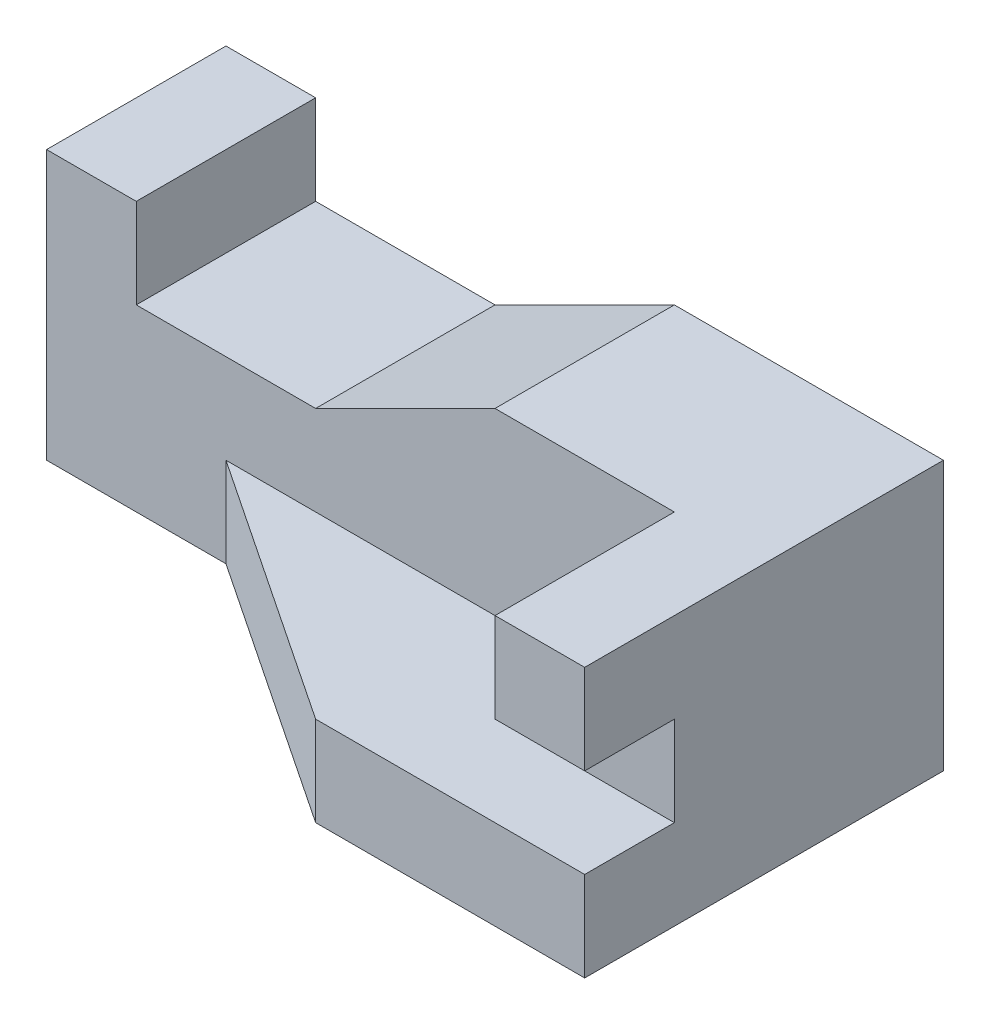
ISO-10303-21;
HEADER;
FILE_DESCRIPTION(('STEP AP214'),'2;1');
FILE_NAME('part.step','',(''),(''),'','','');
FILE_SCHEMA(('AUTOMOTIVE_DESIGN { 1 0 10303 214 1 1 1 1 }'));
ENDSEC;
DATA;
#1=APPLICATION_CONTEXT('core data for automotive mechanical design processes');
#2=APPLICATION_PROTOCOL_DEFINITION('international standard','automotive_design',2000,#1);
#3=PRODUCT_CONTEXT('',#1,'mechanical');
#4=PRODUCT('Part','Part','',(#3));
#5=PRODUCT_RELATED_PRODUCT_CATEGORY('part','',(#4));
#6=PRODUCT_DEFINITION_FORMATION('','',#4);
#7=PRODUCT_DEFINITION_CONTEXT('part definition',#1,'design');
#8=PRODUCT_DEFINITION('design','',#6,#7);
#9=PRODUCT_DEFINITION_SHAPE('','',#8);
#10=(LENGTH_UNIT() NAMED_UNIT(*) SI_UNIT(.MILLI.,.METRE.));
#11=(NAMED_UNIT(*) PLANE_ANGLE_UNIT() SI_UNIT($,.RADIAN.));
#12=(NAMED_UNIT(*) SI_UNIT($,.STERADIAN.) SOLID_ANGLE_UNIT());
#13=UNCERTAINTY_MEASURE_WITH_UNIT(LENGTH_MEASURE(1.E-05),#10,'distance_accuracy_value','');
#14=(GEOMETRIC_REPRESENTATION_CONTEXT(3) GLOBAL_UNCERTAINTY_ASSIGNED_CONTEXT((#13)) GLOBAL_UNIT_ASSIGNED_CONTEXT((#10,
#11,#12)) REPRESENTATION_CONTEXT('',''));
#15=CARTESIAN_POINT('',(0.,0.,0.));
#16=DIRECTION('',(0.,0.,1.));
#17=DIRECTION('',(1.,0.,0.));
#18=AXIS2_PLACEMENT_3D('',#15,#16,#17);
#19=CARTESIAN_POINT('',(0.,0.,30.));
#20=DIRECTION('',(0.,0.,-1.));
#21=DIRECTION('',(-1.,0.,0.));
#22=AXIS2_PLACEMENT_3D('',#19,#20,#21);
#23=PLANE('',#22);
#24=DIRECTION('',(1.,0.,0.));
#25=VECTOR('',#24,1.);
#26=CARTESIAN_POINT('',(30.9664043726146,2.70131461150638,30.));
#27=LINE('',#26,#25);
#28=CARTESIAN_POINT('',(30.9664043726146,2.70131461150638,30.));
#29=VERTEX_POINT('',#28);
#30=CARTESIAN_POINT('',(40.9664043726146,2.70131461150638,30.));
#31=VERTEX_POINT('',#30);
#32=EDGE_CURVE('E48',#29,#31,#27,.T.);
#33=ORIENTED_EDGE('',*,*,#32,.F.);
#34=DIRECTION('',(0.,-1.,0.));
#35=VECTOR('',#34,1.);
#36=CARTESIAN_POINT('',(30.9664043726146,12.7013146115064,30.));
#37=LINE('',#36,#35);
#38=CARTESIAN_POINT('',(30.9664043726146,-7.29868538849361,30.));
#39=VERTEX_POINT('',#38);
#40=EDGE_CURVE('E163',#29,#39,#37,.T.);
#41=ORIENTED_EDGE('',*,*,#40,.T.);
#42=DIRECTION('',(1.,0.,0.));
#43=VECTOR('',#42,1.);
#44=CARTESIAN_POINT('',(40.9664043726146,-7.29868538849361,30.));
#45=LINE('',#44,#43);
#46=CARTESIAN_POINT('',(40.9664043726146,-7.29868538849361,30.));
#47=VERTEX_POINT('',#46);
#48=EDGE_CURVE('E172',#39,#47,#45,.T.);
#49=ORIENTED_EDGE('',*,*,#48,.T.);
#50=DIRECTION('',(0.,1.,0.));
#51=VECTOR('',#50,1.);
#52=CARTESIAN_POINT('',(40.9664043726146,12.7013146115064,30.));
#53=LINE('',#52,#51);
#54=EDGE_CURVE('E53',#47,#31,#53,.T.);
#55=ORIENTED_EDGE('',*,*,#54,.T.);
#56=EDGE_LOOP('',(#33,#41,#49,#55));
#57=FACE_BOUND('',#56,.T.);
#58=ADVANCED_FACE('F33',(#57),#23,.F.);
#59=CARTESIAN_POINT('',(0.,0.,20.));
#60=DIRECTION('',(0.,0.,1.));
#61=DIRECTION('',(1.,0.,0.));
#62=AXIS2_PLACEMENT_3D('',#59,#60,#61);
#63=PLANE('',#62);
#64=DIRECTION('',(-1.,0.,0.));
#65=VECTOR('',#64,1.);
#66=CARTESIAN_POINT('',(40.9664043726146,-7.29868538849361,20.));
#67=LINE('',#66,#65);
#68=CARTESIAN_POINT('',(30.9664043726146,-7.29868538849361,20.));
#69=VERTEX_POINT('',#68);
#70=CARTESIAN_POINT('',(-19.0335956273854,-7.29868538849361,20.));
#71=VERTEX_POINT('',#70);
#72=EDGE_CURVE('E186',#69,#71,#67,.T.);
#73=ORIENTED_EDGE('',*,*,#72,.F.);
#74=DIRECTION('',(0.,-1.,0.));
#75=VECTOR('',#74,1.);
#76=CARTESIAN_POINT('',(30.9664043726146,12.7013146115064,20.));
#77=LINE('',#76,#75);
#78=CARTESIAN_POINT('',(30.9664043726146,12.7013146115064,20.));
#79=VERTEX_POINT('',#78);
#80=EDGE_CURVE('E164',#79,#69,#77,.T.);
#81=ORIENTED_EDGE('',*,*,#80,.F.);
#82=DIRECTION('',(-1.,0.,0.));
#83=VECTOR('',#82,1.);
#84=CARTESIAN_POINT('',(10.9664043726146,12.7013146115064,20.));
#85=LINE('',#84,#83);
#86=CARTESIAN_POINT('',(10.9664043726146,12.7013146115064,20.));
#87=VERTEX_POINT('',#86);
#88=EDGE_CURVE('E203',#79,#87,#85,.T.);
#89=ORIENTED_EDGE('',*,*,#88,.T.);
#90=DIRECTION('',(-0.894427190999916,-0.447213595499958,0.));
#91=VECTOR('',#90,1.);
#92=CARTESIAN_POINT('',(-9.03359562738539,2.70131461150638,20.));
#93=LINE('',#92,#91);
#94=CARTESIAN_POINT('',(-9.03359562738539,2.70131461150638,20.));
#95=VERTEX_POINT('',#94);
#96=EDGE_CURVE('E205',#87,#95,#93,.T.);
#97=ORIENTED_EDGE('',*,*,#96,.T.);
#98=DIRECTION('',(-1.,0.,0.));
#99=VECTOR('',#98,1.);
#100=CARTESIAN_POINT('',(-29.0335956273854,2.70131461150638,20.));
#101=LINE('',#100,#99);
#102=CARTESIAN_POINT('',(-29.0335956273854,2.70131461150638,20.));
#103=VERTEX_POINT('',#102);
#104=EDGE_CURVE('E208',#95,#103,#101,.T.);
#105=ORIENTED_EDGE('',*,*,#104,.T.);
#106=DIRECTION('',(0.,1.,0.));
#107=VECTOR('',#106,1.);
#108=CARTESIAN_POINT('',(-29.0335956273854,12.7013146115064,20.));
#109=LINE('',#108,#107);
#110=CARTESIAN_POINT('',(-29.0335956273854,12.7013146115064,20.));
#111=VERTEX_POINT('',#110);
#112=EDGE_CURVE('E210',#103,#111,#109,.T.);
#113=ORIENTED_EDGE('',*,*,#112,.T.);
#114=DIRECTION('',(-1.,0.,0.));
#115=VECTOR('',#114,1.);
#116=CARTESIAN_POINT('',(-39.0335956273854,12.7013146115064,20.));
#117=LINE('',#116,#115);
#118=CARTESIAN_POINT('',(-39.0335956273854,12.7013146115064,20.));
#119=VERTEX_POINT('',#118);
#120=EDGE_CURVE('E212',#111,#119,#117,.T.);
#121=ORIENTED_EDGE('',*,*,#120,.T.);
#122=DIRECTION('',(0.,-1.,0.));
#123=VECTOR('',#122,1.);
#124=CARTESIAN_POINT('',(-39.0335956273854,-17.2986853884936,20.));
#125=LINE('',#124,#123);
#126=CARTESIAN_POINT('',(-39.0335956273854,-17.2986853884936,20.));
#127=VERTEX_POINT('',#126);
#128=EDGE_CURVE('E214',#119,#127,#125,.T.);
#129=ORIENTED_EDGE('',*,*,#128,.T.);
#130=DIRECTION('',(1.,0.,0.));
#131=VECTOR('',#130,1.);
#132=CARTESIAN_POINT('',(-39.0335956273854,-17.2986853884936,20.));
#133=LINE('',#132,#131);
#134=CARTESIAN_POINT('',(-19.0335956273854,-17.2986853884936,20.));
#135=VERTEX_POINT('',#134);
#136=EDGE_CURVE('E216',#127,#135,#133,.T.);
#137=ORIENTED_EDGE('',*,*,#136,.T.);
#138=DIRECTION('',(0.,-1.,0.));
#139=VECTOR('',#138,1.);
#140=CARTESIAN_POINT('',(-19.0335956273854,-7.29868538849361,20.));
#141=LINE('',#140,#139);
#142=EDGE_CURVE('E182',#71,#135,#141,.T.);
#143=ORIENTED_EDGE('',*,*,#142,.F.);
#144=EDGE_LOOP('',(#73,#81,#89,#97,#105,#113,#121,#129,#137,#143));
#145=FACE_BOUND('',#144,.T.);
#146=ADVANCED_FACE('F277',(#145),#63,.T.);
#147=CARTESIAN_POINT('',(40.9664043726146,-7.29868538849361,40.));
#148=DIRECTION('',(0.,-1.,0.));
#149=DIRECTION('',(1.,0.,0.));
#150=AXIS2_PLACEMENT_3D('',#147,#148,#149);
#151=PLANE('',#150);
#152=DIRECTION('',(0.,0.,-1.));
#153=VECTOR('',#152,1.);
#154=CARTESIAN_POINT('',(30.9664043726146,-7.29868538849361,30.));
#155=LINE('',#154,#153);
#156=EDGE_CURVE('E173',#39,#69,#155,.T.);
#157=ORIENTED_EDGE('',*,*,#156,.T.);
#158=ORIENTED_EDGE('',*,*,#72,.T.);
#159=DIRECTION('',(-0.832050294337844,0.,-0.554700196225229));
#160=VECTOR('',#159,1.);
#161=CARTESIAN_POINT('',(10.9664043726146,-7.29868538849361,40.));
#162=LINE('',#161,#160);
#163=CARTESIAN_POINT('',(10.9664043726146,-7.29868538849361,40.));
#164=VERTEX_POINT('',#163);
#165=EDGE_CURVE('E179',#164,#71,#162,.T.);
#166=ORIENTED_EDGE('',*,*,#165,.F.);
#167=DIRECTION('',(-1.,0.,0.));
#168=VECTOR('',#167,1.);
#169=CARTESIAN_POINT('',(40.9664043726146,-7.29868538849361,40.));
#170=LINE('',#169,#168);
#171=CARTESIAN_POINT('',(40.9664043726146,-7.29868538849361,40.));
#172=VERTEX_POINT('',#171);
#173=EDGE_CURVE('E190',#172,#164,#170,.T.);
#174=ORIENTED_EDGE('',*,*,#173,.F.);
#175=DIRECTION('',(0.,0.,-1.));
#176=VECTOR('',#175,1.);
#177=CARTESIAN_POINT('',(40.9664043726146,-7.29868538849361,40.));
#178=LINE('',#177,#176);
#179=EDGE_CURVE('E199',#172,#47,#178,.T.);
#180=ORIENTED_EDGE('',*,*,#179,.T.);
#181=ORIENTED_EDGE('',*,*,#48,.F.);
#182=EDGE_LOOP('',(#157,#158,#166,#174,#180,#181));
#183=FACE_BOUND('',#182,.T.);
#184=ADVANCED_FACE('F299',(#183),#151,.F.);
#185=CARTESIAN_POINT('',(10.9664043726146,12.7013146115064,20.));
#186=DIRECTION('',(0.,-1.,0.));
#187=DIRECTION('',(0.,0.,-1.));
#188=AXIS2_PLACEMENT_3D('',#185,#186,#187);
#189=PLANE('',#188);
#190=DIRECTION('',(-1.,0.,0.));
#191=VECTOR('',#190,1.);
#192=CARTESIAN_POINT('',(10.9664043726146,12.7013146115064,0.));
#193=LINE('',#192,#191);
#194=CARTESIAN_POINT('',(40.9664043726146,12.7013146115064,0.));
#195=VERTEX_POINT('',#194);
#196=CARTESIAN_POINT('',(10.9664043726146,12.7013146115064,0.));
#197=VERTEX_POINT('',#196);
#198=EDGE_CURVE('E202',#195,#197,#193,.T.);
#199=ORIENTED_EDGE('',*,*,#198,.T.);
#200=DIRECTION('',(0.,0.,-1.));
#201=VECTOR('',#200,1.);
#202=CARTESIAN_POINT('',(10.9664043726146,12.7013146115064,20.));
#203=LINE('',#202,#201);
#204=EDGE_CURVE('E11',#87,#197,#203,.T.);
#205=ORIENTED_EDGE('',*,*,#204,.F.);
#206=ORIENTED_EDGE('',*,*,#88,.F.);
#207=DIRECTION('',(0.,0.,-1.));
#208=VECTOR('',#207,1.);
#209=CARTESIAN_POINT('',(30.9664043726146,12.7013146115064,30.));
#210=LINE('',#209,#208);
#211=CARTESIAN_POINT('',(30.9664043726146,12.7013146115064,40.));
#212=VERTEX_POINT('',#211);
#213=EDGE_CURVE('E176',#212,#79,#210,.T.);
#214=ORIENTED_EDGE('',*,*,#213,.F.);
#215=DIRECTION('',(-1.,0.,0.));
#216=VECTOR('',#215,1.);
#217=CARTESIAN_POINT('',(30.9664043726146,12.7013146115064,40.));
#218=LINE('',#217,#216);
#219=CARTESIAN_POINT('',(40.9664043726146,12.7013146115064,40.));
#220=VERTEX_POINT('',#219);
#221=EDGE_CURVE('E156',#220,#212,#218,.T.);
#222=ORIENTED_EDGE('',*,*,#221,.F.);
#223=DIRECTION('',(0.,0.,-1.));
#224=VECTOR('',#223,1.);
#225=CARTESIAN_POINT('',(40.9664043726146,12.7013146115064,20.));
#226=LINE('',#225,#224);
#227=EDGE_CURVE('E219',#220,#195,#226,.T.);
#228=ORIENTED_EDGE('',*,*,#227,.T.);
#229=EDGE_LOOP('',(#199,#205,#206,#214,#222,#228));
#230=FACE_BOUND('',#229,.T.);
#231=ADVANCED_FACE('F35',(#230),#189,.F.);
#232=CARTESIAN_POINT('',(-9.03359562738539,2.70131461150638,20.));
#233=DIRECTION('',(0.447213595499958,-0.894427190999916,0.));
#234=DIRECTION('',(0.894427190999916,0.447213595499958,0.));
#235=AXIS2_PLACEMENT_3D('',#232,#233,#234);
#236=PLANE('',#235);
#237=DIRECTION('',(-0.894427190999916,-0.447213595499958,0.));
#238=VECTOR('',#237,1.);
#239=CARTESIAN_POINT('',(-9.03359562738539,2.70131461150638,0.));
#240=LINE('',#239,#238);
#241=CARTESIAN_POINT('',(-9.03359562738539,2.70131461150638,0.));
#242=VERTEX_POINT('',#241);
#243=EDGE_CURVE('E222',#197,#242,#240,.T.);
#244=ORIENTED_EDGE('',*,*,#243,.T.);
#245=DIRECTION('',(0.,0.,-1.));
#246=VECTOR('',#245,1.);
#247=CARTESIAN_POINT('',(-9.03359562738539,2.70131461150638,20.));
#248=LINE('',#247,#246);
#249=EDGE_CURVE('E41',#95,#242,#248,.T.);
#250=ORIENTED_EDGE('',*,*,#249,.F.);
#251=ORIENTED_EDGE('',*,*,#96,.F.);
#252=ORIENTED_EDGE('',*,*,#204,.T.);
#253=EDGE_LOOP('',(#244,#250,#251,#252));
#254=FACE_BOUND('',#253,.T.);
#255=ADVANCED_FACE('F281',(#254),#236,.F.);
#256=CARTESIAN_POINT('',(-29.0335956273854,2.70131461150638,20.));
#257=DIRECTION('',(0.,-1.,0.));
#258=DIRECTION('',(0.,0.,-1.));
#259=AXIS2_PLACEMENT_3D('',#256,#257,#258);
#260=PLANE('',#259);
#261=DIRECTION('',(-1.,0.,0.));
#262=VECTOR('',#261,1.);
#263=CARTESIAN_POINT('',(-29.0335956273854,2.70131461150638,0.));
#264=LINE('',#263,#262);
#265=CARTESIAN_POINT('',(-29.0335956273854,2.70131461150638,0.));
#266=VERTEX_POINT('',#265);
#267=EDGE_CURVE('E224',#242,#266,#264,.T.);
#268=ORIENTED_EDGE('',*,*,#267,.T.);
#269=DIRECTION('',(0.,0.,-1.));
#270=VECTOR('',#269,1.);
#271=CARTESIAN_POINT('',(-29.0335956273854,2.70131461150638,20.));
#272=LINE('',#271,#270);
#273=EDGE_CURVE('E249',#103,#266,#272,.T.);
#274=ORIENTED_EDGE('',*,*,#273,.F.);
#275=ORIENTED_EDGE('',*,*,#104,.F.);
#276=ORIENTED_EDGE('',*,*,#249,.T.);
#277=EDGE_LOOP('',(#268,#274,#275,#276));
#278=FACE_BOUND('',#277,.T.);
#279=ADVANCED_FACE('F256',(#278),#260,.F.);
#280=CARTESIAN_POINT('',(-29.0335956273854,12.7013146115064,20.));
#281=DIRECTION('',(-1.,0.,0.));
#282=DIRECTION('',(0.,0.,1.));
#283=AXIS2_PLACEMENT_3D('',#280,#281,#282);
#284=PLANE('',#283);
#285=DIRECTION('',(0.,1.,0.));
#286=VECTOR('',#285,1.);
#287=CARTESIAN_POINT('',(-29.0335956273854,12.7013146115064,0.));
#288=LINE('',#287,#286);
#289=CARTESIAN_POINT('',(-29.0335956273854,12.7013146115064,0.));
#290=VERTEX_POINT('',#289);
#291=EDGE_CURVE('E226',#266,#290,#288,.T.);
#292=ORIENTED_EDGE('',*,*,#291,.T.);
#293=DIRECTION('',(0.,0.,-1.));
#294=VECTOR('',#293,1.);
#295=CARTESIAN_POINT('',(-29.0335956273854,12.7013146115064,20.));
#296=LINE('',#295,#294);
#297=EDGE_CURVE('E246',#111,#290,#296,.T.);
#298=ORIENTED_EDGE('',*,*,#297,.F.);
#299=ORIENTED_EDGE('',*,*,#112,.F.);
#300=ORIENTED_EDGE('',*,*,#273,.T.);
#301=EDGE_LOOP('',(#292,#298,#299,#300));
#302=FACE_BOUND('',#301,.T.);
#303=ADVANCED_FACE('F268',(#302),#284,.F.);
#304=CARTESIAN_POINT('',(-39.0335956273854,12.7013146115064,20.));
#305=DIRECTION('',(0.,-1.,0.));
#306=DIRECTION('',(0.,0.,-1.));
#307=AXIS2_PLACEMENT_3D('',#304,#305,#306);
#308=PLANE('',#307);
#309=DIRECTION('',(-1.,0.,0.));
#310=VECTOR('',#309,1.);
#311=CARTESIAN_POINT('',(-39.0335956273854,12.7013146115064,0.));
#312=LINE('',#311,#310);
#313=CARTESIAN_POINT('',(-39.0335956273854,12.7013146115064,0.));
#314=VERTEX_POINT('',#313);
#315=EDGE_CURVE('E228',#290,#314,#312,.T.);
#316=ORIENTED_EDGE('',*,*,#315,.T.);
#317=DIRECTION('',(0.,0.,-1.));
#318=VECTOR('',#317,1.);
#319=CARTESIAN_POINT('',(-39.0335956273854,12.7013146115064,20.));
#320=LINE('',#319,#318);
#321=EDGE_CURVE('E243',#119,#314,#320,.T.);
#322=ORIENTED_EDGE('',*,*,#321,.F.);
#323=ORIENTED_EDGE('',*,*,#120,.F.);
#324=ORIENTED_EDGE('',*,*,#297,.T.);
#325=EDGE_LOOP('',(#316,#322,#323,#324));
#326=FACE_BOUND('',#325,.T.);
#327=ADVANCED_FACE('F272',(#326),#308,.F.);
#328=CARTESIAN_POINT('',(-39.0335956273854,-17.2986853884936,20.));
#329=DIRECTION('',(1.,0.,0.));
#330=DIRECTION('',(0.,0.,-1.));
#331=AXIS2_PLACEMENT_3D('',#328,#329,#330);
#332=PLANE('',#331);
#333=DIRECTION('',(0.,-1.,0.));
#334=VECTOR('',#333,1.);
#335=CARTESIAN_POINT('',(-39.0335956273854,-17.2986853884936,0.));
#336=LINE('',#335,#334);
#337=CARTESIAN_POINT('',(-39.0335956273854,-17.2986853884936,0.));
#338=VERTEX_POINT('',#337);
#339=EDGE_CURVE('E230',#314,#338,#336,.T.);
#340=ORIENTED_EDGE('',*,*,#339,.T.);
#341=DIRECTION('',(0.,0.,-1.));
#342=VECTOR('',#341,1.);
#343=CARTESIAN_POINT('',(-39.0335956273854,-17.2986853884936,20.));
#344=LINE('',#343,#342);
#345=EDGE_CURVE('E240',#127,#338,#344,.T.);
#346=ORIENTED_EDGE('',*,*,#345,.F.);
#347=ORIENTED_EDGE('',*,*,#128,.F.);
#348=ORIENTED_EDGE('',*,*,#321,.T.);
#349=EDGE_LOOP('',(#340,#346,#347,#348));
#350=FACE_BOUND('',#349,.T.);
#351=ADVANCED_FACE('F326',(#350),#332,.F.);
#352=CARTESIAN_POINT('',(-39.0335956273854,-17.2986853884936,20.));
#353=DIRECTION('',(0.,1.,0.));
#354=DIRECTION('',(0.,0.,1.));
#355=AXIS2_PLACEMENT_3D('',#352,#353,#354);
#356=PLANE('',#355);
#357=DIRECTION('',(1.,0.,0.));
#358=VECTOR('',#357,1.);
#359=CARTESIAN_POINT('',(-39.0335956273854,-17.2986853884936,0.));
#360=LINE('',#359,#358);
#361=CARTESIAN_POINT('',(40.9664043726146,-17.2986853884936,0.));
#362=VERTEX_POINT('',#361);
#363=EDGE_CURVE('E232',#338,#362,#360,.T.);
#364=ORIENTED_EDGE('',*,*,#363,.T.);
#365=DIRECTION('',(0.,0.,-1.));
#366=VECTOR('',#365,1.);
#367=CARTESIAN_POINT('',(40.9664043726146,-17.2986853884936,20.));
#368=LINE('',#367,#366);
#369=CARTESIAN_POINT('',(40.9664043726146,-17.2986853884936,40.));
#370=VERTEX_POINT('',#369);
#371=EDGE_CURVE('E237',#370,#362,#368,.T.);
#372=ORIENTED_EDGE('',*,*,#371,.F.);
#373=DIRECTION('',(1.,0.,0.));
#374=VECTOR('',#373,1.);
#375=CARTESIAN_POINT('',(40.9664043726146,-17.2986853884936,40.));
#376=LINE('',#375,#374);
#377=CARTESIAN_POINT('',(10.9664043726146,-17.2986853884936,40.));
#378=VERTEX_POINT('',#377);
#379=EDGE_CURVE('E196',#378,#370,#376,.T.);
#380=ORIENTED_EDGE('',*,*,#379,.F.);
#381=DIRECTION('',(-0.832050294337844,0.,-0.554700196225229));
#382=VECTOR('',#381,1.);
#383=CARTESIAN_POINT('',(10.9664043726146,-17.2986853884936,40.));
#384=LINE('',#383,#382);
#385=EDGE_CURVE('E178',#378,#135,#384,.T.);
#386=ORIENTED_EDGE('',*,*,#385,.T.);
#387=ORIENTED_EDGE('',*,*,#136,.F.);
#388=ORIENTED_EDGE('',*,*,#345,.T.);
#389=EDGE_LOOP('',(#364,#372,#380,#386,#387,#388));
#390=FACE_BOUND('',#389,.T.);
#391=ADVANCED_FACE('F291',(#390),#356,.F.);
#392=CARTESIAN_POINT('',(40.9664043726146,-17.2986853884936,20.));
#393=DIRECTION('',(-1.,0.,0.));
#394=DIRECTION('',(0.,0.,1.));
#395=AXIS2_PLACEMENT_3D('',#392,#393,#394);
#396=PLANE('',#395);
#397=ORIENTED_EDGE('',*,*,#227,.F.);
#398=DIRECTION('',(0.,1.,0.));
#399=VECTOR('',#398,1.);
#400=CARTESIAN_POINT('',(40.9664043726146,12.7013146115064,40.));
#401=LINE('',#400,#399);
#402=CARTESIAN_POINT('',(40.9664043726146,2.70131461150638,40.));
#403=VERTEX_POINT('',#402);
#404=EDGE_CURVE('E149',#403,#220,#401,.T.);
#405=ORIENTED_EDGE('',*,*,#404,.F.);
#406=DIRECTION('',(0.,0.,-1.));
#407=VECTOR('',#406,1.);
#408=CARTESIAN_POINT('',(40.9664043726146,2.70131461150638,40.));
#409=LINE('',#408,#407);
#410=EDGE_CURVE('E145',#403,#31,#409,.T.);
#411=ORIENTED_EDGE('',*,*,#410,.T.);
#412=ORIENTED_EDGE('',*,*,#54,.F.);
#413=ORIENTED_EDGE('',*,*,#179,.F.);
#414=DIRECTION('',(0.,1.,0.));
#415=VECTOR('',#414,1.);
#416=CARTESIAN_POINT('',(40.9664043726146,-17.2986853884936,40.));
#417=LINE('',#416,#415);
#418=EDGE_CURVE('E187',#370,#172,#417,.T.);
#419=ORIENTED_EDGE('',*,*,#418,.F.);
#420=ORIENTED_EDGE('',*,*,#371,.T.);
#421=DIRECTION('',(0.,1.,0.));
#422=VECTOR('',#421,1.);
#423=CARTESIAN_POINT('',(40.9664043726146,-17.2986853884936,0.));
#424=LINE('',#423,#422);
#425=EDGE_CURVE('E206',#362,#195,#424,.T.);
#426=ORIENTED_EDGE('',*,*,#425,.T.);
#427=EDGE_LOOP('',(#397,#405,#411,#412,#413,#419,#420,#426));
#428=FACE_BOUND('',#427,.T.);
#429=ADVANCED_FACE('F286',(#428),#396,.F.);
#430=CARTESIAN_POINT('',(0.,0.,0.));
#431=DIRECTION('',(0.,0.,1.));
#432=DIRECTION('',(1.,0.,0.));
#433=AXIS2_PLACEMENT_3D('',#430,#431,#432);
#434=PLANE('',#433);
#435=ORIENTED_EDGE('',*,*,#198,.F.);
#436=ORIENTED_EDGE('',*,*,#425,.F.);
#437=ORIENTED_EDGE('',*,*,#363,.F.);
#438=ORIENTED_EDGE('',*,*,#339,.F.);
#439=ORIENTED_EDGE('',*,*,#315,.F.);
#440=ORIENTED_EDGE('',*,*,#291,.F.);
#441=ORIENTED_EDGE('',*,*,#267,.F.);
#442=ORIENTED_EDGE('',*,*,#243,.F.);
#443=EDGE_LOOP('',(#435,#436,#437,#438,#439,#440,#441,#442));
#444=FACE_BOUND('',#443,.T.);
#445=ADVANCED_FACE('F263',(#444),#434,.F.);
#446=CARTESIAN_POINT('',(0.,0.,40.));
#447=DIRECTION('',(0.,0.,1.));
#448=DIRECTION('',(1.,0.,0.));
#449=AXIS2_PLACEMENT_3D('',#446,#447,#448);
#450=PLANE('',#449);
#451=ORIENTED_EDGE('',*,*,#418,.T.);
#452=ORIENTED_EDGE('',*,*,#173,.T.);
#453=DIRECTION('',(0.,-1.,0.));
#454=VECTOR('',#453,1.);
#455=CARTESIAN_POINT('',(10.9664043726146,-17.2986853884936,40.));
#456=LINE('',#455,#454);
#457=EDGE_CURVE('E193',#164,#378,#456,.T.);
#458=ORIENTED_EDGE('',*,*,#457,.T.);
#459=ORIENTED_EDGE('',*,*,#379,.T.);
#460=EDGE_LOOP('',(#451,#452,#458,#459));
#461=FACE_BOUND('',#460,.T.);
#462=ADVANCED_FACE('F293',(#461),#450,.T.);
#463=CARTESIAN_POINT('',(10.9664043726146,-7.29868538849361,40.));
#464=DIRECTION('',(-0.554700196225229,0.,0.832050294337844));
#465=DIRECTION('',(0.832050294337844,0.,0.554700196225229));
#466=AXIS2_PLACEMENT_3D('',#463,#464,#465);
#467=PLANE('',#466);
#468=ORIENTED_EDGE('',*,*,#385,.F.);
#469=ORIENTED_EDGE('',*,*,#457,.F.);
#470=ORIENTED_EDGE('',*,*,#165,.T.);
#471=ORIENTED_EDGE('',*,*,#142,.T.);
#472=EDGE_LOOP('',(#468,#469,#470,#471));
#473=FACE_BOUND('',#472,.T.);
#474=ADVANCED_FACE('F296',(#473),#467,.T.);
#475=CARTESIAN_POINT('',(30.9664043726146,12.7013146115064,30.));
#476=DIRECTION('',(1.,0.,0.));
#477=DIRECTION('',(0.,0.,-1.));
#478=AXIS2_PLACEMENT_3D('',#475,#476,#477);
#479=PLANE('',#478);
#480=ORIENTED_EDGE('',*,*,#80,.T.);
#481=ORIENTED_EDGE('',*,*,#156,.F.);
#482=ORIENTED_EDGE('',*,*,#40,.F.);
#483=DIRECTION('',(0.,0.,-1.));
#484=VECTOR('',#483,1.);
#485=CARTESIAN_POINT('',(30.9664043726146,2.70131461150638,40.));
#486=LINE('',#485,#484);
#487=CARTESIAN_POINT('',(30.9664043726146,2.70131461150638,40.));
#488=VERTEX_POINT('',#487);
#489=EDGE_CURVE('E143',#488,#29,#486,.T.);
#490=ORIENTED_EDGE('',*,*,#489,.F.);
#491=DIRECTION('',(0.,-1.,0.));
#492=VECTOR('',#491,1.);
#493=CARTESIAN_POINT('',(30.9664043726146,12.7013146115064,40.));
#494=LINE('',#493,#492);
#495=EDGE_CURVE('E150',#212,#488,#494,.T.);
#496=ORIENTED_EDGE('',*,*,#495,.F.);
#497=ORIENTED_EDGE('',*,*,#213,.T.);
#498=EDGE_LOOP('',(#480,#481,#482,#490,#496,#497));
#499=FACE_BOUND('',#498,.T.);
#500=ADVANCED_FACE('F161',(#499),#479,.F.);
#501=CARTESIAN_POINT('',(30.9664043726146,2.70131461150638,40.));
#502=DIRECTION('',(0.,1.,0.));
#503=DIRECTION('',(0.,0.,1.));
#504=AXIS2_PLACEMENT_3D('',#501,#502,#503);
#505=PLANE('',#504);
#506=ORIENTED_EDGE('',*,*,#32,.T.);
#507=ORIENTED_EDGE('',*,*,#410,.F.);
#508=DIRECTION('',(1.,0.,0.));
#509=VECTOR('',#508,1.);
#510=CARTESIAN_POINT('',(30.9664043726146,2.70131461150638,40.));
#511=LINE('',#510,#509);
#512=EDGE_CURVE('E139',#488,#403,#511,.T.);
#513=ORIENTED_EDGE('',*,*,#512,.F.);
#514=ORIENTED_EDGE('',*,*,#489,.T.);
#515=EDGE_LOOP('',(#506,#507,#513,#514));
#516=FACE_BOUND('',#515,.T.);
#517=ADVANCED_FACE('F141',(#516),#505,.F.);
#518=CARTESIAN_POINT('',(0.,0.,40.));
#519=DIRECTION('',(0.,0.,1.));
#520=DIRECTION('',(1.,0.,0.));
#521=AXIS2_PLACEMENT_3D('',#518,#519,#520);
#522=PLANE('',#521);
#523=ORIENTED_EDGE('',*,*,#495,.T.);
#524=ORIENTED_EDGE('',*,*,#512,.T.);
#525=ORIENTED_EDGE('',*,*,#404,.T.);
#526=ORIENTED_EDGE('',*,*,#221,.T.);
#527=EDGE_LOOP('',(#523,#524,#525,#526));
#528=FACE_BOUND('',#527,.T.);
#529=ADVANCED_FACE('F154',(#528),#522,.T.);
#530=CLOSED_SHELL('',(#58,#146,#184,#231,#255,#279,#303,#327,#351,#391,#429,#445,#462,#474,#500,
#517,#529));
#531=MANIFOLD_SOLID_BREP('B2',#530);
#532=ADVANCED_BREP_SHAPE_REPRESENTATION('',(#18,#531),#14);
#533=SHAPE_DEFINITION_REPRESENTATION(#9,#532);
ENDSEC;
END-ISO-10303-21;
